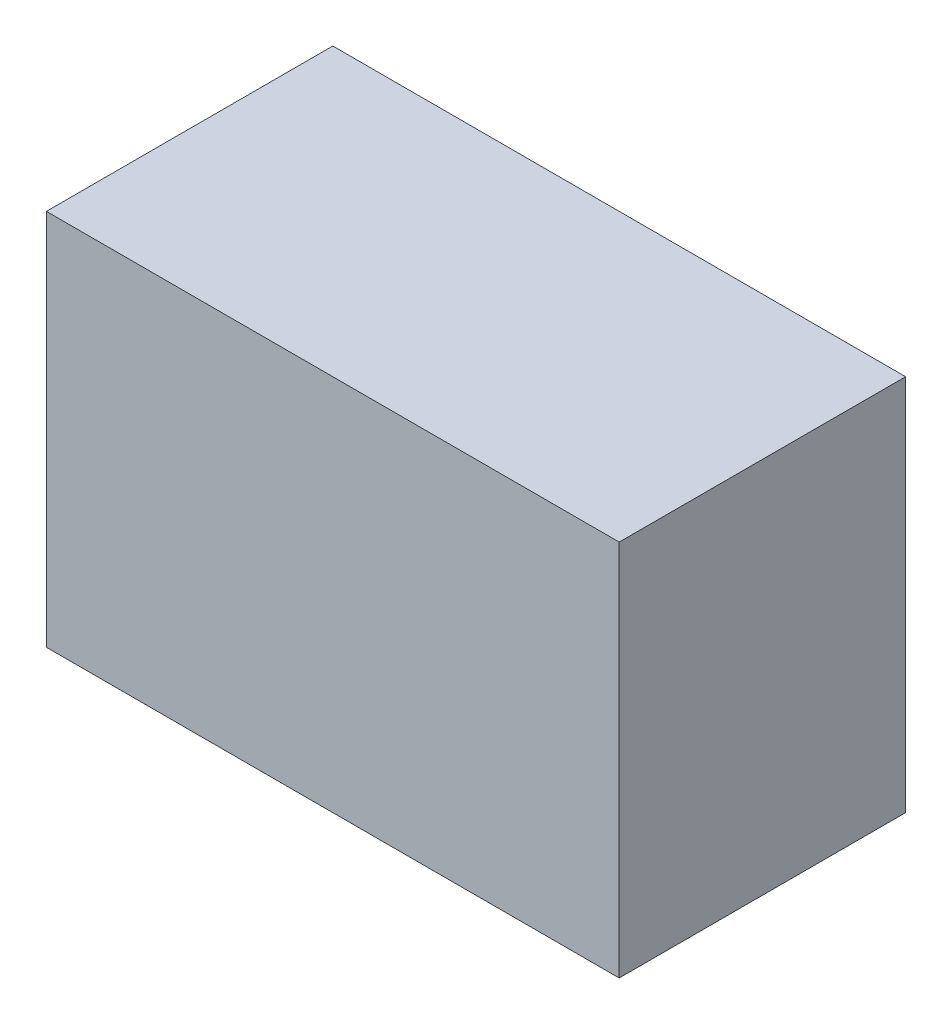
ISO-10303-21;
HEADER;
FILE_DESCRIPTION(('STEP AP214'),'2;1');
FILE_NAME('part.step','',(''),(''),'','','');
FILE_SCHEMA(('AUTOMOTIVE_DESIGN { 1 0 10303 214 1 1 1 1 }'));
ENDSEC;
DATA;
#1=APPLICATION_CONTEXT('core data for automotive mechanical design processes');
#2=APPLICATION_PROTOCOL_DEFINITION('international standard','automotive_design',2000,#1);
#3=PRODUCT_CONTEXT('',#1,'mechanical');
#4=PRODUCT('Part','Part','',(#3));
#5=PRODUCT_RELATED_PRODUCT_CATEGORY('part','',(#4));
#6=PRODUCT_DEFINITION_FORMATION('','',#4);
#7=PRODUCT_DEFINITION_CONTEXT('part definition',#1,'design');
#8=PRODUCT_DEFINITION('design','',#6,#7);
#9=PRODUCT_DEFINITION_SHAPE('','',#8);
#10=(LENGTH_UNIT() NAMED_UNIT(*) SI_UNIT(.MILLI.,.METRE.));
#11=(NAMED_UNIT(*) PLANE_ANGLE_UNIT() SI_UNIT($,.RADIAN.));
#12=(NAMED_UNIT(*) SI_UNIT($,.STERADIAN.) SOLID_ANGLE_UNIT());
#13=UNCERTAINTY_MEASURE_WITH_UNIT(LENGTH_MEASURE(1.E-05),#10,'distance_accuracy_value','');
#14=(GEOMETRIC_REPRESENTATION_CONTEXT(3) GLOBAL_UNCERTAINTY_ASSIGNED_CONTEXT((#13)) GLOBAL_UNIT_ASSIGNED_CONTEXT((#10,
#11,#12)) REPRESENTATION_CONTEXT('',''));
#15=CARTESIAN_POINT('',(0.,0.,0.));
#16=DIRECTION('',(0.,0.,1.));
#17=DIRECTION('',(1.,0.,0.));
#18=AXIS2_PLACEMENT_3D('',#15,#16,#17);
#19=CARTESIAN_POINT('',(-1.10000034,-0.72499982,0.));
#20=DIRECTION('',(0.,1.,0.));
#21=DIRECTION('',(1.,0.,0.));
#22=AXIS2_PLACEMENT_3D('',#19,#20,#21);
#23=PLANE('',#22);
#24=DIRECTION('',(1.,0.,0.));
#25=VECTOR('',#24,1.);
#26=CARTESIAN_POINT('',(-1.10000034,-0.72499982,0.));
#27=LINE('',#26,#25);
#28=CARTESIAN_POINT('',(-1.10000034,-0.72499982,0.));
#29=VERTEX_POINT('',#28);
#30=CARTESIAN_POINT('',(1.10000034,-0.72499982,0.));
#31=VERTEX_POINT('',#30);
#32=EDGE_CURVE('E9',#29,#31,#27,.T.);
#33=ORIENTED_EDGE('',*,*,#32,.T.);
#34=DIRECTION('',(0.,0.,1.));
#35=VECTOR('',#34,1.);
#36=CARTESIAN_POINT('',(1.10000034,-0.72499982,0.));
#37=LINE('',#36,#35);
#38=CARTESIAN_POINT('',(1.10000034,-0.72499982,1.10000034));
#39=VERTEX_POINT('',#38);
#40=EDGE_CURVE('E22',#31,#39,#37,.T.);
#41=ORIENTED_EDGE('',*,*,#40,.T.);
#42=DIRECTION('',(1.,0.,0.));
#43=VECTOR('',#42,1.);
#44=CARTESIAN_POINT('',(-1.10000034,-0.72499982,1.10000034));
#45=LINE('',#44,#43);
#46=CARTESIAN_POINT('',(-1.10000034,-0.72499982,1.10000034));
#47=VERTEX_POINT('',#46);
#48=EDGE_CURVE('E84',#47,#39,#45,.T.);
#49=ORIENTED_EDGE('',*,*,#48,.F.);
#50=DIRECTION('',(0.,0.,1.));
#51=VECTOR('',#50,1.);
#52=CARTESIAN_POINT('',(-1.10000034,-0.72499982,0.));
#53=LINE('',#52,#51);
#54=EDGE_CURVE('E32',#29,#47,#53,.T.);
#55=ORIENTED_EDGE('',*,*,#54,.F.);
#56=EDGE_LOOP('',(#33,#41,#49,#55));
#57=FACE_BOUND('',#56,.T.);
#58=ADVANCED_FACE('F15',(#57),#23,.F.);
#59=CARTESIAN_POINT('',(1.10000034,-0.72499982,0.));
#60=DIRECTION('',(-1.,0.,0.));
#61=DIRECTION('',(0.,1.,0.));
#62=AXIS2_PLACEMENT_3D('',#59,#60,#61);
#63=PLANE('',#62);
#64=DIRECTION('',(0.,1.,0.));
#65=VECTOR('',#64,1.);
#66=CARTESIAN_POINT('',(1.10000034,-0.72499982,0.));
#67=LINE('',#66,#65);
#68=CARTESIAN_POINT('',(1.10000034,0.72499982,0.));
#69=VERTEX_POINT('',#68);
#70=EDGE_CURVE('E81',#31,#69,#67,.T.);
#71=ORIENTED_EDGE('',*,*,#70,.T.);
#72=DIRECTION('',(0.,0.,1.));
#73=VECTOR('',#72,1.);
#74=CARTESIAN_POINT('',(1.10000034,0.72499982,0.));
#75=LINE('',#74,#73);
#76=CARTESIAN_POINT('',(1.10000034,0.72499982,1.10000034));
#77=VERTEX_POINT('',#76);
#78=EDGE_CURVE('E79',#69,#77,#75,.T.);
#79=ORIENTED_EDGE('',*,*,#78,.T.);
#80=DIRECTION('',(0.,1.,0.));
#81=VECTOR('',#80,1.);
#82=CARTESIAN_POINT('',(1.10000034,-0.72499982,1.10000034));
#83=LINE('',#82,#81);
#84=EDGE_CURVE('E65',#39,#77,#83,.T.);
#85=ORIENTED_EDGE('',*,*,#84,.F.);
#86=ORIENTED_EDGE('',*,*,#40,.F.);
#87=EDGE_LOOP('',(#71,#79,#85,#86));
#88=FACE_BOUND('',#87,.T.);
#89=ADVANCED_FACE('F87',(#88),#63,.F.);
#90=CARTESIAN_POINT('',(1.10000034,0.72499982,0.));
#91=DIRECTION('',(0.,-1.,0.));
#92=DIRECTION('',(-1.,0.,0.));
#93=AXIS2_PLACEMENT_3D('',#90,#91,#92);
#94=PLANE('',#93);
#95=DIRECTION('',(-1.,0.,0.));
#96=VECTOR('',#95,1.);
#97=CARTESIAN_POINT('',(1.10000034,0.72499982,0.));
#98=LINE('',#97,#96);
#99=CARTESIAN_POINT('',(-1.10000034,0.72499982,0.));
#100=VERTEX_POINT('',#99);
#101=EDGE_CURVE('E72',#69,#100,#98,.T.);
#102=ORIENTED_EDGE('',*,*,#101,.T.);
#103=DIRECTION('',(0.,0.,1.));
#104=VECTOR('',#103,1.);
#105=CARTESIAN_POINT('',(-1.10000034,0.72499982,0.));
#106=LINE('',#105,#104);
#107=CARTESIAN_POINT('',(-1.10000034,0.72499982,1.10000034));
#108=VERTEX_POINT('',#107);
#109=EDGE_CURVE('E57',#100,#108,#106,.T.);
#110=ORIENTED_EDGE('',*,*,#109,.T.);
#111=DIRECTION('',(-1.,0.,0.));
#112=VECTOR('',#111,1.);
#113=CARTESIAN_POINT('',(1.10000034,0.72499982,1.10000034));
#114=LINE('',#113,#112);
#115=EDGE_CURVE('E62',#77,#108,#114,.T.);
#116=ORIENTED_EDGE('',*,*,#115,.F.);
#117=ORIENTED_EDGE('',*,*,#78,.F.);
#118=EDGE_LOOP('',(#102,#110,#116,#117));
#119=FACE_BOUND('',#118,.T.);
#120=ADVANCED_FACE('F70',(#119),#94,.F.);
#121=CARTESIAN_POINT('',(-1.10000034,0.72499982,0.));
#122=DIRECTION('',(1.,0.,0.));
#123=DIRECTION('',(0.,-1.,0.));
#124=AXIS2_PLACEMENT_3D('',#121,#122,#123);
#125=PLANE('',#124);
#126=DIRECTION('',(0.,-1.,0.));
#127=VECTOR('',#126,1.);
#128=CARTESIAN_POINT('',(-1.10000034,0.72499982,0.));
#129=LINE('',#128,#127);
#130=EDGE_CURVE('E59',#100,#29,#129,.T.);
#131=ORIENTED_EDGE('',*,*,#130,.T.);
#132=ORIENTED_EDGE('',*,*,#54,.T.);
#133=DIRECTION('',(0.,-1.,0.));
#134=VECTOR('',#133,1.);
#135=CARTESIAN_POINT('',(-1.10000034,0.72499982,1.10000034));
#136=LINE('',#135,#134);
#137=EDGE_CURVE('E52',#108,#47,#136,.T.);
#138=ORIENTED_EDGE('',*,*,#137,.F.);
#139=ORIENTED_EDGE('',*,*,#109,.F.);
#140=EDGE_LOOP('',(#131,#132,#138,#139));
#141=FACE_BOUND('',#140,.T.);
#142=ADVANCED_FACE('F55',(#141),#125,.F.);
#143=CARTESIAN_POINT('',(-1.10000034,-0.72499982,0.));
#144=DIRECTION('',(0.,0.,-1.));
#145=DIRECTION('',(-1.,0.,0.));
#146=AXIS2_PLACEMENT_3D('',#143,#144,#145);
#147=PLANE('',#146);
#148=ORIENTED_EDGE('',*,*,#130,.F.);
#149=ORIENTED_EDGE('',*,*,#101,.F.);
#150=ORIENTED_EDGE('',*,*,#70,.F.);
#151=ORIENTED_EDGE('',*,*,#32,.F.);
#152=EDGE_LOOP('',(#148,#149,#150,#151));
#153=FACE_BOUND('',#152,.T.);
#154=ADVANCED_FACE('F89',(#153),#147,.T.);
#155=CARTESIAN_POINT('',(-1.10000034,-0.72499982,1.10000034));
#156=DIRECTION('',(0.,0.,-1.));
#157=DIRECTION('',(-1.,0.,0.));
#158=AXIS2_PLACEMENT_3D('',#155,#156,#157);
#159=PLANE('',#158);
#160=ORIENTED_EDGE('',*,*,#48,.T.);
#161=ORIENTED_EDGE('',*,*,#84,.T.);
#162=ORIENTED_EDGE('',*,*,#115,.T.);
#163=ORIENTED_EDGE('',*,*,#137,.T.);
#164=EDGE_LOOP('',(#160,#161,#162,#163));
#165=FACE_BOUND('',#164,.T.);
#166=ADVANCED_FACE('F63',(#165),#159,.F.);
#167=CLOSED_SHELL('',(#58,#89,#120,#142,#154,#166));
#168=MANIFOLD_SOLID_BREP('B1',#167);
#169=ADVANCED_BREP_SHAPE_REPRESENTATION('',(#18,#168),#14);
#170=SHAPE_DEFINITION_REPRESENTATION(#9,#169);
ENDSEC;
END-ISO-10303-21;
